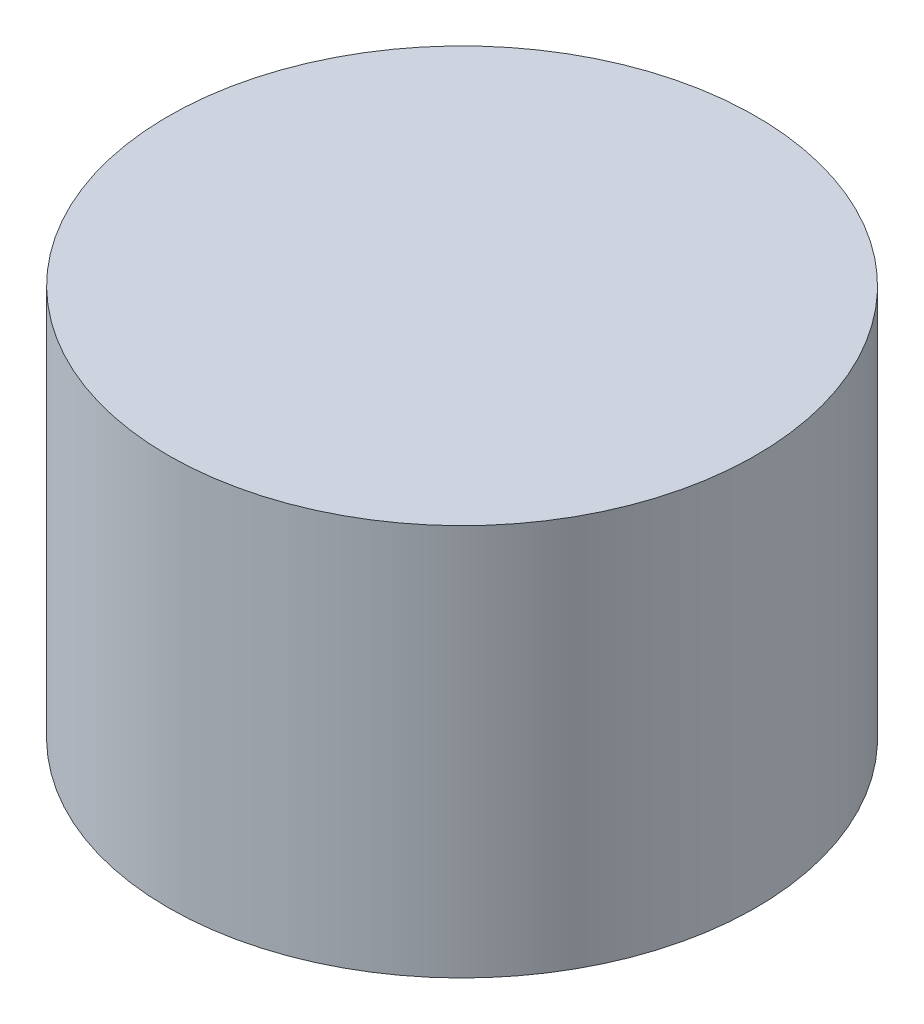
ISO-10303-21;
HEADER;
FILE_DESCRIPTION(('STEP AP214'),'2;1');
FILE_NAME('part.step','',(''),(''),'','','');
FILE_SCHEMA(('AUTOMOTIVE_DESIGN { 1 0 10303 214 1 1 1 1 }'));
ENDSEC;
DATA;
#1=APPLICATION_CONTEXT('core data for automotive mechanical design processes');
#2=APPLICATION_PROTOCOL_DEFINITION('international standard','automotive_design',2000,#1);
#3=PRODUCT_CONTEXT('',#1,'mechanical');
#4=PRODUCT('Part','Part','',(#3));
#5=PRODUCT_RELATED_PRODUCT_CATEGORY('part','',(#4));
#6=PRODUCT_DEFINITION_FORMATION('','',#4);
#7=PRODUCT_DEFINITION_CONTEXT('part definition',#1,'design');
#8=PRODUCT_DEFINITION('design','',#6,#7);
#9=PRODUCT_DEFINITION_SHAPE('','',#8);
#10=(LENGTH_UNIT() NAMED_UNIT(*) SI_UNIT(.MILLI.,.METRE.));
#11=(NAMED_UNIT(*) PLANE_ANGLE_UNIT() SI_UNIT($,.RADIAN.));
#12=(NAMED_UNIT(*) SI_UNIT($,.STERADIAN.) SOLID_ANGLE_UNIT());
#13=UNCERTAINTY_MEASURE_WITH_UNIT(LENGTH_MEASURE(1.E-05),#10,'distance_accuracy_value','');
#14=(GEOMETRIC_REPRESENTATION_CONTEXT(3) GLOBAL_UNCERTAINTY_ASSIGNED_CONTEXT((#13)) GLOBAL_UNIT_ASSIGNED_CONTEXT((#10,
#11,#12)) REPRESENTATION_CONTEXT('',''));
#15=CARTESIAN_POINT('',(0.,0.,0.));
#16=DIRECTION('',(0.,0.,1.));
#17=DIRECTION('',(1.,0.,0.));
#18=AXIS2_PLACEMENT_3D('',#15,#16,#17);
#19=CARTESIAN_POINT('',(0.,50.8,0.));
#20=DIRECTION('',(0.,-1.,0.));
#21=DIRECTION('',(0.,0.,-1.));
#22=AXIS2_PLACEMENT_3D('',#19,#20,#21);
#23=CYLINDRICAL_SURFACE('',#22,38.1);
#24=CARTESIAN_POINT('',(0.,50.8,0.));
#25=DIRECTION('',(0.,1.,0.));
#26=DIRECTION('',(0.,0.,1.));
#27=AXIS2_PLACEMENT_3D('',#24,#25,#26);
#28=CIRCLE('',#27,38.1);
#29=CARTESIAN_POINT('',(0.,50.8,38.1));
#30=VERTEX_POINT('',#29);
#31=EDGE_CURVE('E10',#30,#30,#28,.T.);
#32=ORIENTED_EDGE('',*,*,#31,.F.);
#33=EDGE_LOOP('',(#32));
#34=FACE_BOUND('',#33,.T.);
#35=CARTESIAN_POINT('',(0.,0.,0.));
#36=DIRECTION('',(0.,1.,0.));
#37=DIRECTION('',(0.,0.,1.));
#38=AXIS2_PLACEMENT_3D('',#35,#36,#37);
#39=CIRCLE('',#38,38.1);
#40=CARTESIAN_POINT('',(0.,0.,38.1));
#41=VERTEX_POINT('',#40);
#42=EDGE_CURVE('E34',#41,#41,#39,.T.);
#43=ORIENTED_EDGE('',*,*,#42,.T.);
#44=EDGE_LOOP('',(#43));
#45=FACE_BOUND('',#44,.T.);
#46=ADVANCED_FACE('F31',(#34,#45),#23,.T.);
#47=CARTESIAN_POINT('',(0.,50.8,0.));
#48=DIRECTION('',(0.,1.,0.));
#49=DIRECTION('',(0.,0.,1.));
#50=AXIS2_PLACEMENT_3D('',#47,#48,#49);
#51=PLANE('',#50);
#52=ORIENTED_EDGE('',*,*,#31,.T.);
#53=EDGE_LOOP('',(#52));
#54=FACE_BOUND('',#53,.T.);
#55=ADVANCED_FACE('F46',(#54),#51,.T.);
#56=CARTESIAN_POINT('',(0.,0.,0.));
#57=DIRECTION('',(0.,1.,0.));
#58=DIRECTION('',(0.,0.,1.));
#59=AXIS2_PLACEMENT_3D('',#56,#57,#58);
#60=PLANE('',#59);
#61=ORIENTED_EDGE('',*,*,#42,.F.);
#62=EDGE_LOOP('',(#61));
#63=FACE_BOUND('',#62,.T.);
#64=ADVANCED_FACE('F44',(#63),#60,.F.);
#65=CLOSED_SHELL('',(#46,#55,#64));
#66=MANIFOLD_SOLID_BREP('B2',#65);
#67=ADVANCED_BREP_SHAPE_REPRESENTATION('',(#18,#66),#14);
#68=SHAPE_DEFINITION_REPRESENTATION(#9,#67);
ENDSEC;
END-ISO-10303-21;
